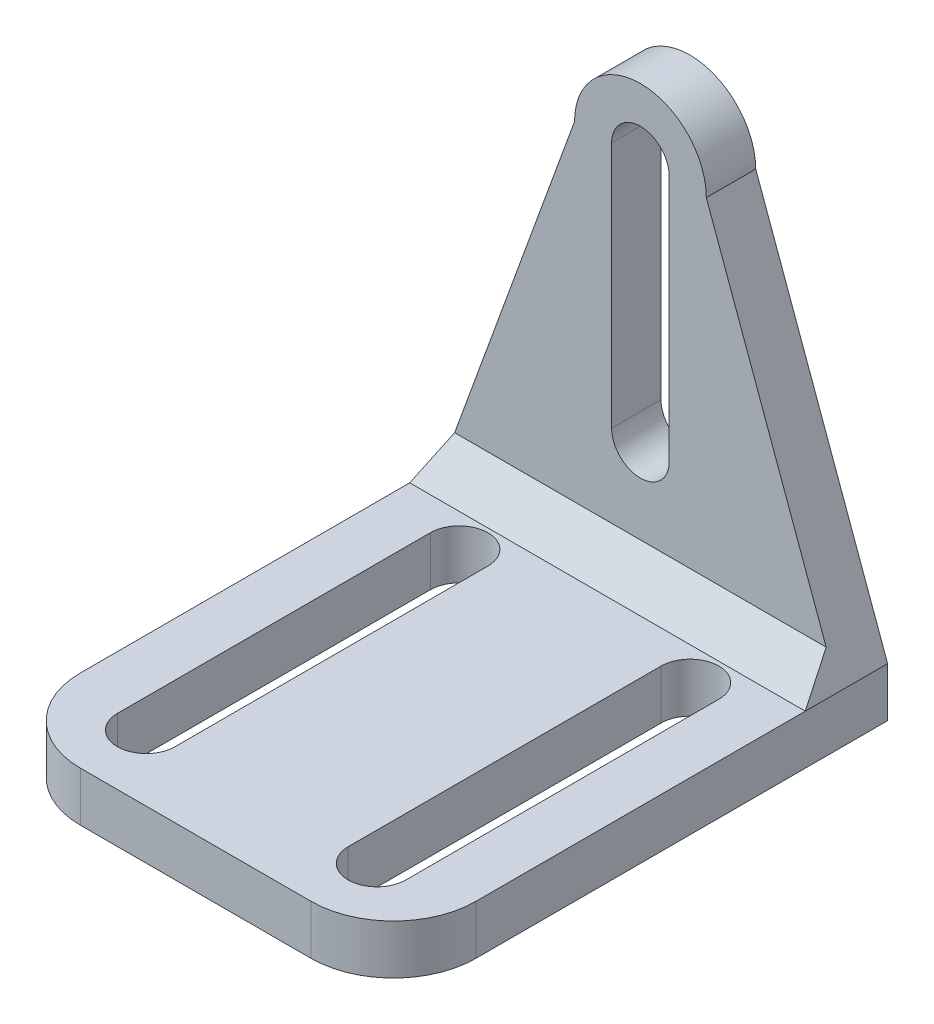
ISO-10303-21;
HEADER;
FILE_DESCRIPTION(('STEP AP214'),'2;1');
FILE_NAME('part.step','',(''),(''),'','','');
FILE_SCHEMA(('AUTOMOTIVE_DESIGN { 1 0 10303 214 1 1 1 1 }'));
ENDSEC;
DATA;
#1=APPLICATION_CONTEXT('core data for automotive mechanical design processes');
#2=APPLICATION_PROTOCOL_DEFINITION('international standard','automotive_design',2000,#1);
#3=PRODUCT_CONTEXT('',#1,'mechanical');
#4=PRODUCT('Part','Part','',(#3));
#5=PRODUCT_RELATED_PRODUCT_CATEGORY('part','',(#4));
#6=PRODUCT_DEFINITION_FORMATION('','',#4);
#7=PRODUCT_DEFINITION_CONTEXT('part definition',#1,'design');
#8=PRODUCT_DEFINITION('design','',#6,#7);
#9=PRODUCT_DEFINITION_SHAPE('','',#8);
#10=(LENGTH_UNIT() NAMED_UNIT(*) SI_UNIT(.MILLI.,.METRE.));
#11=(NAMED_UNIT(*) PLANE_ANGLE_UNIT() SI_UNIT($,.RADIAN.));
#12=(NAMED_UNIT(*) SI_UNIT($,.STERADIAN.) SOLID_ANGLE_UNIT());
#13=UNCERTAINTY_MEASURE_WITH_UNIT(LENGTH_MEASURE(1.E-05),#10,'distance_accuracy_value','');
#14=(GEOMETRIC_REPRESENTATION_CONTEXT(3) GLOBAL_UNCERTAINTY_ASSIGNED_CONTEXT((#13)) GLOBAL_UNIT_ASSIGNED_CONTEXT((#10,
#11,#12)) REPRESENTATION_CONTEXT('',''));
#15=CARTESIAN_POINT('',(0.,0.,0.));
#16=DIRECTION('',(0.,0.,1.));
#17=DIRECTION('',(1.,0.,0.));
#18=AXIS2_PLACEMENT_3D('',#15,#16,#17);
#19=CARTESIAN_POINT('',(1.75,0.,3.));
#20=DIRECTION('',(1.,0.,0.));
#21=DIRECTION('',(0.,1.,0.));
#22=AXIS2_PLACEMENT_3D('',#19,#20,#21);
#23=PLANE('',#22);
#24=DIRECTION('',(0.,-1.,0.));
#25=VECTOR('',#24,1.);
#26=CARTESIAN_POINT('',(1.75,0.,0.));
#27=LINE('',#26,#25);
#28=CARTESIAN_POINT('',(1.75,0.,0.));
#29=VERTEX_POINT('',#28);
#30=CARTESIAN_POINT('',(1.75,-15.,0.));
#31=VERTEX_POINT('',#30);
#32=EDGE_CURVE('E305',#29,#31,#27,.T.);
#33=ORIENTED_EDGE('',*,*,#32,.T.);
#34=DIRECTION('',(0.,0.,-1.));
#35=VECTOR('',#34,1.);
#36=CARTESIAN_POINT('',(1.75,-15.,3.));
#37=LINE('',#36,#35);
#38=CARTESIAN_POINT('',(1.75,-15.,3.));
#39=VERTEX_POINT('',#38);
#40=EDGE_CURVE('E323',#39,#31,#37,.T.);
#41=ORIENTED_EDGE('',*,*,#40,.F.);
#42=DIRECTION('',(0.,-1.,0.));
#43=VECTOR('',#42,1.);
#44=CARTESIAN_POINT('',(1.75,0.,3.));
#45=LINE('',#44,#43);
#46=CARTESIAN_POINT('',(1.75,0.,3.));
#47=VERTEX_POINT('',#46);
#48=EDGE_CURVE('E288',#47,#39,#45,.T.);
#49=ORIENTED_EDGE('',*,*,#48,.F.);
#50=DIRECTION('',(0.,0.,-1.));
#51=VECTOR('',#50,1.);
#52=CARTESIAN_POINT('',(1.75,0.,3.));
#53=LINE('',#52,#51);
#54=EDGE_CURVE('E316',#47,#29,#53,.T.);
#55=ORIENTED_EDGE('',*,*,#54,.T.);
#56=EDGE_LOOP('',(#33,#41,#49,#55));
#57=FACE_BOUND('',#56,.T.);
#58=ADVANCED_FACE('F43',(#57),#23,.F.);
#59=CARTESIAN_POINT('',(0.,-15.,3.));
#60=DIRECTION('',(0.,0.,-1.));
#61=DIRECTION('',(-1.,0.,0.));
#62=AXIS2_PLACEMENT_3D('',#59,#60,#61);
#63=CYLINDRICAL_SURFACE('',#62,1.75);
#64=CARTESIAN_POINT('',(0.,-15.,0.));
#65=DIRECTION('',(0.,0.,1.));
#66=DIRECTION('',(1.,0.,0.));
#67=AXIS2_PLACEMENT_3D('',#64,#65,#66);
#68=CIRCLE('',#67,1.75);
#69=CARTESIAN_POINT('',(-1.75,-15.,0.));
#70=VERTEX_POINT('',#69);
#71=EDGE_CURVE('E308',#70,#31,#68,.T.);
#72=ORIENTED_EDGE('',*,*,#71,.F.);
#73=DIRECTION('',(0.,0.,-1.));
#74=VECTOR('',#73,1.);
#75=CARTESIAN_POINT('',(-1.75,-15.,3.));
#76=LINE('',#75,#74);
#77=CARTESIAN_POINT('',(-1.75,-15.,3.));
#78=VERTEX_POINT('',#77);
#79=EDGE_CURVE('E321',#78,#70,#76,.T.);
#80=ORIENTED_EDGE('',*,*,#79,.F.);
#81=CARTESIAN_POINT('',(0.,-15.,3.));
#82=DIRECTION('',(0.,0.,1.));
#83=DIRECTION('',(1.,0.,0.));
#84=AXIS2_PLACEMENT_3D('',#81,#82,#83);
#85=CIRCLE('',#84,1.75);
#86=EDGE_CURVE('E290',#78,#39,#85,.T.);
#87=ORIENTED_EDGE('',*,*,#86,.T.);
#88=ORIENTED_EDGE('',*,*,#40,.T.);
#89=EDGE_LOOP('',(#72,#80,#87,#88));
#90=FACE_BOUND('',#89,.T.);
#91=ADVANCED_FACE('F427',(#90),#63,.F.);
#92=CARTESIAN_POINT('',(-1.75,0.,3.));
#93=DIRECTION('',(1.,0.,0.));
#94=DIRECTION('',(0.,1.,0.));
#95=AXIS2_PLACEMENT_3D('',#92,#93,#94);
#96=PLANE('',#95);
#97=DIRECTION('',(0.,-1.,0.));
#98=VECTOR('',#97,1.);
#99=CARTESIAN_POINT('',(-1.75,0.,0.));
#100=LINE('',#99,#98);
#101=CARTESIAN_POINT('',(-1.75,0.,0.));
#102=VERTEX_POINT('',#101);
#103=EDGE_CURVE('E311',#102,#70,#100,.T.);
#104=ORIENTED_EDGE('',*,*,#103,.F.);
#105=DIRECTION('',(0.,0.,-1.));
#106=VECTOR('',#105,1.);
#107=CARTESIAN_POINT('',(-1.75,0.,3.));
#108=LINE('',#107,#106);
#109=CARTESIAN_POINT('',(-1.75,0.,3.));
#110=VERTEX_POINT('',#109);
#111=EDGE_CURVE('E318',#110,#102,#108,.T.);
#112=ORIENTED_EDGE('',*,*,#111,.F.);
#113=DIRECTION('',(0.,-1.,0.));
#114=VECTOR('',#113,1.);
#115=CARTESIAN_POINT('',(-1.75,0.,3.));
#116=LINE('',#115,#114);
#117=EDGE_CURVE('E293',#110,#78,#116,.T.);
#118=ORIENTED_EDGE('',*,*,#117,.T.);
#119=ORIENTED_EDGE('',*,*,#79,.T.);
#120=EDGE_LOOP('',(#104,#112,#118,#119));
#121=FACE_BOUND('',#120,.T.);
#122=ADVANCED_FACE('F432',(#121),#96,.T.);
#123=CARTESIAN_POINT('',(3.53208888623797,1.28557521937306,3.));
#124=DIRECTION('',(-0.93969262078591,-0.342020143325663,0.));
#125=DIRECTION('',(0.342020143325663,-0.939692620785911,0.));
#126=AXIS2_PLACEMENT_3D('',#123,#124,#125);
#127=PLANE('',#126);
#128=DIRECTION('',(-0.342020143325663,0.939692620785911,0.));
#129=VECTOR('',#128,1.);
#130=CARTESIAN_POINT('',(3.53208888623797,1.28557521937306,0.));
#131=LINE('',#130,#129);
#132=CARTESIAN_POINT('',(12.0073451538563,-22.,0.));
#133=VERTEX_POINT('',#132);
#134=CARTESIAN_POINT('',(4.,0.,0.));
#135=VERTEX_POINT('',#134);
#136=EDGE_CURVE('E280',#133,#135,#131,.T.);
#137=ORIENTED_EDGE('',*,*,#136,.T.);
#138=DIRECTION('',(0.,0.,-1.));
#139=VECTOR('',#138,1.);
#140=CARTESIAN_POINT('',(4.,0.,3.));
#141=LINE('',#140,#139);
#142=CARTESIAN_POINT('',(4.,0.,3.));
#143=VERTEX_POINT('',#142);
#144=EDGE_CURVE('E319',#143,#135,#141,.T.);
#145=ORIENTED_EDGE('',*,*,#144,.F.);
#146=DIRECTION('',(-0.342020143325663,0.939692620785911,0.));
#147=VECTOR('',#146,1.);
#148=CARTESIAN_POINT('',(3.53208888623797,1.28557521937306,3.));
#149=LINE('',#148,#147);
#150=CARTESIAN_POINT('',(11.2794046853239,-20.,3.));
#151=VERTEX_POINT('',#150);
#152=EDGE_CURVE('E281',#151,#143,#149,.T.);
#153=ORIENTED_EDGE('',*,*,#152,.F.);
#154=DIRECTION('',(0.249243569363949,-0.684791078771734,0.68479107877174));
#155=VECTOR('',#154,1.);
#156=CARTESIAN_POINT('',(7.16510602735606,-8.69605734034066,-8.30394265965946));
#157=LINE('',#156,#155);
#158=CARTESIAN_POINT('',(12.0073451538563,-22.,5.00000000000002));
#159=VERTEX_POINT('',#158);
#160=EDGE_CURVE('E11',#151,#159,#157,.T.);
#161=ORIENTED_EDGE('',*,*,#160,.T.);
#162=DIRECTION('',(0.,0.,-1.));
#163=VECTOR('',#162,1.);
#164=CARTESIAN_POINT('',(12.0073451538563,-22.,3.));
#165=LINE('',#164,#163);
#166=EDGE_CURVE('E59',#159,#133,#165,.T.);
#167=ORIENTED_EDGE('',*,*,#166,.T.);
#168=EDGE_LOOP('',(#137,#145,#153,#161,#167));
#169=FACE_BOUND('',#168,.T.);
#170=ADVANCED_FACE('F382',(#169),#127,.F.);
#171=CARTESIAN_POINT('',(0.,0.,3.));
#172=DIRECTION('',(0.,0.,-1.));
#173=DIRECTION('',(-1.,0.,0.));
#174=AXIS2_PLACEMENT_3D('',#171,#172,#173);
#175=CYLINDRICAL_SURFACE('',#174,4.);
#176=CARTESIAN_POINT('',(0.,0.,0.));
#177=DIRECTION('',(0.,0.,1.));
#178=DIRECTION('',(1.,0.,0.));
#179=AXIS2_PLACEMENT_3D('',#176,#177,#178);
#180=CIRCLE('',#179,4.);
#181=CARTESIAN_POINT('',(-4.,0.,0.));
#182=VERTEX_POINT('',#181);
#183=EDGE_CURVE('E301',#135,#182,#180,.T.);
#184=ORIENTED_EDGE('',*,*,#183,.T.);
#185=DIRECTION('',(0.,0.,-1.));
#186=VECTOR('',#185,1.);
#187=CARTESIAN_POINT('',(-4.,0.,3.));
#188=LINE('',#187,#186);
#189=CARTESIAN_POINT('',(-4.,0.,3.));
#190=VERTEX_POINT('',#189);
#191=EDGE_CURVE('E328',#190,#182,#188,.T.);
#192=ORIENTED_EDGE('',*,*,#191,.F.);
#193=CARTESIAN_POINT('',(0.,0.,3.));
#194=DIRECTION('',(0.,0.,1.));
#195=DIRECTION('',(1.,0.,0.));
#196=AXIS2_PLACEMENT_3D('',#193,#194,#195);
#197=CIRCLE('',#196,4.);
#198=EDGE_CURVE('E283',#143,#190,#197,.T.);
#199=ORIENTED_EDGE('',*,*,#198,.F.);
#200=ORIENTED_EDGE('',*,*,#144,.T.);
#201=EDGE_LOOP('',(#184,#192,#199,#200));
#202=FACE_BOUND('',#201,.T.);
#203=ADVANCED_FACE('F413',(#202),#175,.T.);
#204=CARTESIAN_POINT('',(-3.53208888623797,1.28557521937306,3.));
#205=DIRECTION('',(0.93969262078591,-0.342020143325663,0.));
#206=DIRECTION('',(0.342020143325663,0.939692620785911,0.));
#207=AXIS2_PLACEMENT_3D('',#204,#205,#206);
#208=PLANE('',#207);
#209=DIRECTION('',(-0.342020143325663,-0.939692620785911,0.));
#210=VECTOR('',#209,1.);
#211=CARTESIAN_POINT('',(-3.53208888623797,1.28557521937306,0.));
#212=LINE('',#211,#210);
#213=CARTESIAN_POINT('',(-12.0073451538563,-22.,0.));
#214=VERTEX_POINT('',#213);
#215=EDGE_CURVE('E303',#182,#214,#212,.T.);
#216=ORIENTED_EDGE('',*,*,#215,.T.);
#217=DIRECTION('',(0.,0.,-1.));
#218=VECTOR('',#217,1.);
#219=CARTESIAN_POINT('',(-12.0073451538563,-22.,3.));
#220=LINE('',#219,#218);
#221=CARTESIAN_POINT('',(-12.0073451538563,-22.,5.00000000000002));
#222=VERTEX_POINT('',#221);
#223=EDGE_CURVE('E76',#222,#214,#220,.T.);
#224=ORIENTED_EDGE('',*,*,#223,.F.);
#225=DIRECTION('',(0.249243569363948,0.684791078771734,-0.68479107877174));
#226=VECTOR('',#225,1.);
#227=CARTESIAN_POINT('',(-7.16510602735606,-8.69605734034066,-8.30394265965946));
#228=LINE('',#227,#226);
#229=CARTESIAN_POINT('',(-11.2794046853239,-20.,3.));
#230=VERTEX_POINT('',#229);
#231=EDGE_CURVE('E52',#222,#230,#228,.T.);
#232=ORIENTED_EDGE('',*,*,#231,.T.);
#233=DIRECTION('',(-0.342020143325663,-0.939692620785911,0.));
#234=VECTOR('',#233,1.);
#235=CARTESIAN_POINT('',(-3.53208888623797,1.28557521937306,3.));
#236=LINE('',#235,#234);
#237=EDGE_CURVE('E286',#190,#230,#236,.T.);
#238=ORIENTED_EDGE('',*,*,#237,.F.);
#239=ORIENTED_EDGE('',*,*,#191,.T.);
#240=EDGE_LOOP('',(#216,#224,#232,#238,#239));
#241=FACE_BOUND('',#240,.T.);
#242=ADVANCED_FACE('F414',(#241),#208,.F.);
#243=CARTESIAN_POINT('',(0.,0.,3.));
#244=DIRECTION('',(0.,0.,-1.));
#245=DIRECTION('',(-1.,0.,0.));
#246=AXIS2_PLACEMENT_3D('',#243,#244,#245);
#247=CYLINDRICAL_SURFACE('',#246,1.75);
#248=CARTESIAN_POINT('',(0.,0.,0.));
#249=DIRECTION('',(0.,0.,1.));
#250=DIRECTION('',(1.,0.,0.));
#251=AXIS2_PLACEMENT_3D('',#248,#249,#250);
#252=CIRCLE('',#251,1.75);
#253=EDGE_CURVE('E284',#29,#102,#252,.T.);
#254=ORIENTED_EDGE('',*,*,#253,.F.);
#255=ORIENTED_EDGE('',*,*,#54,.F.);
#256=CARTESIAN_POINT('',(0.,0.,3.));
#257=DIRECTION('',(0.,0.,1.));
#258=DIRECTION('',(1.,0.,0.));
#259=AXIS2_PLACEMENT_3D('',#256,#257,#258);
#260=CIRCLE('',#259,1.75);
#261=EDGE_CURVE('E296',#47,#110,#260,.T.);
#262=ORIENTED_EDGE('',*,*,#261,.T.);
#263=ORIENTED_EDGE('',*,*,#111,.T.);
#264=EDGE_LOOP('',(#254,#255,#262,#263));
#265=FACE_BOUND('',#264,.T.);
#266=ADVANCED_FACE('F416',(#265),#247,.F.);
#267=CARTESIAN_POINT('',(0.,0.,3.));
#268=DIRECTION('',(0.,0.,1.));
#269=DIRECTION('',(1.,0.,0.));
#270=AXIS2_PLACEMENT_3D('',#267,#268,#269);
#271=PLANE('',#270);
#272=ORIENTED_EDGE('',*,*,#237,.T.);
#273=DIRECTION('',(1.,0.,0.));
#274=VECTOR('',#273,1.);
#275=CARTESIAN_POINT('',(0.,-20.,3.));
#276=LINE('',#275,#274);
#277=EDGE_CURVE('E371',#230,#151,#276,.T.);
#278=ORIENTED_EDGE('',*,*,#277,.T.);
#279=ORIENTED_EDGE('',*,*,#152,.T.);
#280=ORIENTED_EDGE('',*,*,#198,.T.);
#281=EDGE_LOOP('',(#272,#278,#279,#280));
#282=FACE_BOUND('',#281,.T.);
#283=ORIENTED_EDGE('',*,*,#48,.T.);
#284=ORIENTED_EDGE('',*,*,#86,.F.);
#285=ORIENTED_EDGE('',*,*,#117,.F.);
#286=ORIENTED_EDGE('',*,*,#261,.F.);
#287=EDGE_LOOP('',(#283,#284,#285,#286));
#288=FACE_BOUND('',#287,.T.);
#289=ADVANCED_FACE('F375',(#282,#288),#271,.T.);
#290=CARTESIAN_POINT('',(0.,0.,0.));
#291=DIRECTION('',(0.,0.,1.));
#292=DIRECTION('',(1.,0.,0.));
#293=AXIS2_PLACEMENT_3D('',#290,#291,#292);
#294=PLANE('',#293);
#295=ORIENTED_EDGE('',*,*,#136,.F.);
#296=DIRECTION('',(0.,-1.,0.));
#297=VECTOR('',#296,1.);
#298=CARTESIAN_POINT('',(12.0073451538563,0.,0.));
#299=LINE('',#298,#297);
#300=CARTESIAN_POINT('',(12.0073451538563,-25.,0.));
#301=VERTEX_POINT('',#300);
#302=EDGE_CURVE('E267',#133,#301,#299,.T.);
#303=ORIENTED_EDGE('',*,*,#302,.T.);
#304=DIRECTION('',(1.,0.,0.));
#305=VECTOR('',#304,1.);
#306=CARTESIAN_POINT('',(0.,-25.,0.));
#307=LINE('',#306,#305);
#308=CARTESIAN_POINT('',(-12.0073451538563,-25.,0.));
#309=VERTEX_POINT('',#308);
#310=EDGE_CURVE('E234',#309,#301,#307,.T.);
#311=ORIENTED_EDGE('',*,*,#310,.F.);
#312=DIRECTION('',(0.,1.,0.));
#313=VECTOR('',#312,1.);
#314=CARTESIAN_POINT('',(-12.0073451538563,0.,0.));
#315=LINE('',#314,#313);
#316=EDGE_CURVE('E261',#309,#214,#315,.T.);
#317=ORIENTED_EDGE('',*,*,#316,.T.);
#318=ORIENTED_EDGE('',*,*,#215,.F.);
#319=ORIENTED_EDGE('',*,*,#183,.F.);
#320=EDGE_LOOP('',(#295,#303,#311,#317,#318,#319));
#321=FACE_BOUND('',#320,.T.);
#322=ORIENTED_EDGE('',*,*,#32,.F.);
#323=ORIENTED_EDGE('',*,*,#253,.T.);
#324=ORIENTED_EDGE('',*,*,#103,.T.);
#325=ORIENTED_EDGE('',*,*,#71,.T.);
#326=EDGE_LOOP('',(#322,#323,#324,#325));
#327=FACE_BOUND('',#326,.T.);
#328=ADVANCED_FACE('F408',(#321,#327),#294,.F.);
#329=CARTESIAN_POINT('',(0.,-22.,30.));
#330=DIRECTION('',(0.,-1.,0.));
#331=DIRECTION('',(1.,0.,0.));
#332=AXIS2_PLACEMENT_3D('',#329,#330,#331);
#333=PLANE('',#332);
#334=DIRECTION('',(0.,0.,1.));
#335=VECTOR('',#334,1.);
#336=CARTESIAN_POINT('',(-8.7573451538563,-22.,0.));
#337=LINE('',#336,#335);
#338=CARTESIAN_POINT('',(-8.75734515385629,-22.,7.00000000000001));
#339=VERTEX_POINT('',#338);
#340=CARTESIAN_POINT('',(-8.7573451538563,-22.,26.));
#341=VERTEX_POINT('',#340);
#342=EDGE_CURVE('E217',#339,#341,#337,.T.);
#343=ORIENTED_EDGE('',*,*,#342,.F.);
#344=CARTESIAN_POINT('',(-7.0073451538563,-22.,7.));
#345=DIRECTION('',(0.,1.,0.));
#346=DIRECTION('',(-1.,0.,0.));
#347=AXIS2_PLACEMENT_3D('',#344,#345,#346);
#348=CIRCLE('',#347,1.75);
#349=CARTESIAN_POINT('',(-5.2573451538563,-22.,7.));
#350=VERTEX_POINT('',#349);
#351=EDGE_CURVE('E222',#350,#339,#348,.T.);
#352=ORIENTED_EDGE('',*,*,#351,.F.);
#353=DIRECTION('',(0.,0.,1.));
#354=VECTOR('',#353,1.);
#355=CARTESIAN_POINT('',(-5.2573451538563,-22.,0.));
#356=LINE('',#355,#354);
#357=CARTESIAN_POINT('',(-5.25734515385629,-22.,26.));
#358=VERTEX_POINT('',#357);
#359=EDGE_CURVE('E227',#350,#358,#356,.T.);
#360=ORIENTED_EDGE('',*,*,#359,.T.);
#361=CARTESIAN_POINT('',(-7.00734515385629,-22.,26.));
#362=DIRECTION('',(0.,1.,0.));
#363=DIRECTION('',(-1.,0.,0.));
#364=AXIS2_PLACEMENT_3D('',#361,#362,#363);
#365=CIRCLE('',#364,1.75);
#366=EDGE_CURVE('E206',#341,#358,#365,.T.);
#367=ORIENTED_EDGE('',*,*,#366,.F.);
#368=EDGE_LOOP('',(#343,#352,#360,#367));
#369=FACE_BOUND('',#368,.T.);
#370=DIRECTION('',(0.,0.,-1.));
#371=VECTOR('',#370,1.);
#372=CARTESIAN_POINT('',(8.7573451538563,-22.,0.));
#373=LINE('',#372,#371);
#374=CARTESIAN_POINT('',(8.7573451538563,-22.,26.));
#375=VERTEX_POINT('',#374);
#376=CARTESIAN_POINT('',(8.7573451538563,-22.,7.));
#377=VERTEX_POINT('',#376);
#378=EDGE_CURVE('E239',#375,#377,#373,.T.);
#379=ORIENTED_EDGE('',*,*,#378,.F.);
#380=CARTESIAN_POINT('',(7.0073451538563,-22.,26.));
#381=DIRECTION('',(0.,1.,0.));
#382=DIRECTION('',(-1.,0.,0.));
#383=AXIS2_PLACEMENT_3D('',#380,#381,#382);
#384=CIRCLE('',#383,1.75);
#385=CARTESIAN_POINT('',(5.2573451538563,-22.,26.));
#386=VERTEX_POINT('',#385);
#387=EDGE_CURVE('E237',#386,#375,#384,.T.);
#388=ORIENTED_EDGE('',*,*,#387,.F.);
#389=DIRECTION('',(0.,0.,1.));
#390=VECTOR('',#389,1.);
#391=CARTESIAN_POINT('',(5.2573451538563,-22.,0.));
#392=LINE('',#391,#390);
#393=CARTESIAN_POINT('',(5.2573451538563,-22.,7.));
#394=VERTEX_POINT('',#393);
#395=EDGE_CURVE('E245',#394,#386,#392,.T.);
#396=ORIENTED_EDGE('',*,*,#395,.F.);
#397=CARTESIAN_POINT('',(7.0073451538563,-22.,7.));
#398=DIRECTION('',(0.,1.,0.));
#399=DIRECTION('',(-1.,0.,0.));
#400=AXIS2_PLACEMENT_3D('',#397,#398,#399);
#401=CIRCLE('',#400,1.75);
#402=EDGE_CURVE('E242',#377,#394,#401,.T.);
#403=ORIENTED_EDGE('',*,*,#402,.F.);
#404=EDGE_LOOP('',(#379,#388,#396,#403));
#405=FACE_BOUND('',#404,.T.);
#406=DIRECTION('',(0.,0.,-1.));
#407=VECTOR('',#406,1.);
#408=CARTESIAN_POINT('',(12.0073451538563,-22.,30.));
#409=LINE('',#408,#407);
#410=CARTESIAN_POINT('',(12.0073451538563,-22.,25.));
#411=VERTEX_POINT('',#410);
#412=EDGE_CURVE('E276',#411,#159,#409,.T.);
#413=ORIENTED_EDGE('',*,*,#412,.T.);
#414=DIRECTION('',(-1.,0.,0.));
#415=VECTOR('',#414,1.);
#416=CARTESIAN_POINT('',(0.,-22.,5.00000000000002));
#417=LINE('',#416,#415);
#418=EDGE_CURVE('E368',#159,#222,#417,.T.);
#419=ORIENTED_EDGE('',*,*,#418,.T.);
#420=DIRECTION('',(0.,0.,-1.));
#421=VECTOR('',#420,1.);
#422=CARTESIAN_POINT('',(-12.0073451538563,-22.,30.));
#423=LINE('',#422,#421);
#424=CARTESIAN_POINT('',(-12.0073451538563,-22.,25.));
#425=VERTEX_POINT('',#424);
#426=EDGE_CURVE('E273',#425,#222,#423,.T.);
#427=ORIENTED_EDGE('',*,*,#426,.F.);
#428=CARTESIAN_POINT('',(-7.0073451538563,-22.,25.));
#429=DIRECTION('',(0.,-1.,0.));
#430=DIRECTION('',(1.,0.,0.));
#431=AXIS2_PLACEMENT_3D('',#428,#429,#430);
#432=CIRCLE('',#431,5.);
#433=CARTESIAN_POINT('',(-7.0073451538563,-22.,30.));
#434=VERTEX_POINT('',#433);
#435=EDGE_CURVE('E357',#425,#434,#432,.F.);
#436=ORIENTED_EDGE('',*,*,#435,.T.);
#437=DIRECTION('',(-1.,0.,0.));
#438=VECTOR('',#437,1.);
#439=CARTESIAN_POINT('',(0.,-22.,30.));
#440=LINE('',#439,#438);
#441=CARTESIAN_POINT('',(7.0073451538563,-22.,30.));
#442=VERTEX_POINT('',#441);
#443=EDGE_CURVE('E260',#442,#434,#440,.T.);
#444=ORIENTED_EDGE('',*,*,#443,.F.);
#445=CARTESIAN_POINT('',(7.0073451538563,-22.,25.));
#446=DIRECTION('',(0.,-1.,0.));
#447=DIRECTION('',(1.,0.,0.));
#448=AXIS2_PLACEMENT_3D('',#445,#446,#447);
#449=CIRCLE('',#448,5.);
#450=EDGE_CURVE('E355',#442,#411,#449,.F.);
#451=ORIENTED_EDGE('',*,*,#450,.T.);
#452=EDGE_LOOP('',(#413,#419,#427,#436,#444,#451));
#453=FACE_BOUND('',#452,.T.);
#454=ADVANCED_FACE('F224',(#369,#405,#453),#333,.F.);
#455=CARTESIAN_POINT('',(0.,-25.,30.));
#456=DIRECTION('',(0.,1.,0.));
#457=DIRECTION('',(-1.,0.,0.));
#458=AXIS2_PLACEMENT_3D('',#455,#456,#457);
#459=PLANE('',#458);
#460=DIRECTION('',(0.,0.,1.));
#461=VECTOR('',#460,1.);
#462=CARTESIAN_POINT('',(-5.25734515385629,-25.,30.));
#463=LINE('',#462,#461);
#464=CARTESIAN_POINT('',(-5.2573451538563,-25.,7.));
#465=VERTEX_POINT('',#464);
#466=CARTESIAN_POINT('',(-5.25734515385629,-25.,26.));
#467=VERTEX_POINT('',#466);
#468=EDGE_CURVE('E347',#465,#467,#463,.T.);
#469=ORIENTED_EDGE('',*,*,#468,.F.);
#470=CARTESIAN_POINT('',(-7.0073451538563,-25.,7.));
#471=DIRECTION('',(0.,1.,0.));
#472=DIRECTION('',(-1.,0.,0.));
#473=AXIS2_PLACEMENT_3D('',#470,#471,#472);
#474=CIRCLE('',#473,1.75);
#475=CARTESIAN_POINT('',(-8.7573451538563,-25.,7.));
#476=VERTEX_POINT('',#475);
#477=EDGE_CURVE('E349',#465,#476,#474,.T.);
#478=ORIENTED_EDGE('',*,*,#477,.T.);
#479=DIRECTION('',(0.,0.,1.));
#480=VECTOR('',#479,1.);
#481=CARTESIAN_POINT('',(-8.75734515385629,-25.,30.));
#482=LINE('',#481,#480);
#483=CARTESIAN_POINT('',(-8.75734515385629,-25.,26.));
#484=VERTEX_POINT('',#483);
#485=EDGE_CURVE('E344',#476,#484,#482,.T.);
#486=ORIENTED_EDGE('',*,*,#485,.T.);
#487=CARTESIAN_POINT('',(-7.00734515385629,-25.,26.));
#488=DIRECTION('',(0.,1.,0.));
#489=DIRECTION('',(-1.,0.,0.));
#490=AXIS2_PLACEMENT_3D('',#487,#488,#489);
#491=CIRCLE('',#490,1.75);
#492=EDGE_CURVE('E209',#484,#467,#491,.T.);
#493=ORIENTED_EDGE('',*,*,#492,.T.);
#494=EDGE_LOOP('',(#469,#478,#486,#493));
#495=FACE_BOUND('',#494,.T.);
#496=DIRECTION('',(0.,0.,1.));
#497=VECTOR('',#496,1.);
#498=CARTESIAN_POINT('',(5.2573451538563,-25.,30.));
#499=LINE('',#498,#497);
#500=CARTESIAN_POINT('',(5.2573451538563,-25.,7.));
#501=VERTEX_POINT('',#500);
#502=CARTESIAN_POINT('',(5.2573451538563,-25.,26.));
#503=VERTEX_POINT('',#502);
#504=EDGE_CURVE('E338',#501,#503,#499,.T.);
#505=ORIENTED_EDGE('',*,*,#504,.T.);
#506=CARTESIAN_POINT('',(7.0073451538563,-25.,26.));
#507=DIRECTION('',(0.,1.,0.));
#508=DIRECTION('',(-1.,0.,0.));
#509=AXIS2_PLACEMENT_3D('',#506,#507,#508);
#510=CIRCLE('',#509,1.75);
#511=CARTESIAN_POINT('',(8.7573451538563,-25.,26.));
#512=VERTEX_POINT('',#511);
#513=EDGE_CURVE('E341',#503,#512,#510,.T.);
#514=ORIENTED_EDGE('',*,*,#513,.T.);
#515=DIRECTION('',(0.,0.,-1.));
#516=VECTOR('',#515,1.);
#517=CARTESIAN_POINT('',(8.7573451538563,-25.,30.));
#518=LINE('',#517,#516);
#519=CARTESIAN_POINT('',(8.7573451538563,-25.,7.));
#520=VERTEX_POINT('',#519);
#521=EDGE_CURVE('E325',#512,#520,#518,.T.);
#522=ORIENTED_EDGE('',*,*,#521,.T.);
#523=CARTESIAN_POINT('',(7.0073451538563,-25.,7.));
#524=DIRECTION('',(0.,1.,0.));
#525=DIRECTION('',(-1.,0.,0.));
#526=AXIS2_PLACEMENT_3D('',#523,#524,#525);
#527=CIRCLE('',#526,1.75);
#528=EDGE_CURVE('E335',#520,#501,#527,.T.);
#529=ORIENTED_EDGE('',*,*,#528,.T.);
#530=EDGE_LOOP('',(#505,#514,#522,#529));
#531=FACE_BOUND('',#530,.T.);
#532=DIRECTION('',(1.,0.,0.));
#533=VECTOR('',#532,1.);
#534=CARTESIAN_POINT('',(0.,-25.,30.));
#535=LINE('',#534,#533);
#536=CARTESIAN_POINT('',(-7.0073451538563,-25.,30.));
#537=VERTEX_POINT('',#536);
#538=CARTESIAN_POINT('',(7.0073451538563,-25.,30.));
#539=VERTEX_POINT('',#538);
#540=EDGE_CURVE('E257',#537,#539,#535,.T.);
#541=ORIENTED_EDGE('',*,*,#540,.F.);
#542=CARTESIAN_POINT('',(-7.0073451538563,-25.,25.));
#543=DIRECTION('',(0.,1.,0.));
#544=DIRECTION('',(-1.,0.,0.));
#545=AXIS2_PLACEMENT_3D('',#542,#543,#544);
#546=CIRCLE('',#545,5.);
#547=CARTESIAN_POINT('',(-12.0073451538563,-25.,25.));
#548=VERTEX_POINT('',#547);
#549=EDGE_CURVE('E364',#537,#548,#546,.F.);
#550=ORIENTED_EDGE('',*,*,#549,.T.);
#551=DIRECTION('',(0.,0.,-1.));
#552=VECTOR('',#551,1.);
#553=CARTESIAN_POINT('',(-12.0073451538563,-25.,30.));
#554=LINE('',#553,#552);
#555=EDGE_CURVE('E264',#548,#309,#554,.T.);
#556=ORIENTED_EDGE('',*,*,#555,.T.);
#557=ORIENTED_EDGE('',*,*,#310,.T.);
#558=DIRECTION('',(0.,0.,-1.));
#559=VECTOR('',#558,1.);
#560=CARTESIAN_POINT('',(12.0073451538563,-25.,30.));
#561=LINE('',#560,#559);
#562=CARTESIAN_POINT('',(12.0073451538563,-25.,25.));
#563=VERTEX_POINT('',#562);
#564=EDGE_CURVE('E278',#563,#301,#561,.T.);
#565=ORIENTED_EDGE('',*,*,#564,.F.);
#566=CARTESIAN_POINT('',(7.0073451538563,-25.,25.));
#567=DIRECTION('',(0.,1.,0.));
#568=DIRECTION('',(-1.,0.,0.));
#569=AXIS2_PLACEMENT_3D('',#566,#567,#568);
#570=CIRCLE('',#569,5.);
#571=EDGE_CURVE('E83',#563,#539,#570,.F.);
#572=ORIENTED_EDGE('',*,*,#571,.T.);
#573=EDGE_LOOP('',(#541,#550,#556,#557,#565,#572));
#574=FACE_BOUND('',#573,.T.);
#575=ADVANCED_FACE('F404',(#495,#531,#574),#459,.F.);
#576=CARTESIAN_POINT('',(12.0073451538563,0.,30.));
#577=DIRECTION('',(1.,0.,0.));
#578=DIRECTION('',(0.,0.,-1.));
#579=AXIS2_PLACEMENT_3D('',#576,#577,#578);
#580=PLANE('',#579);
#581=ORIENTED_EDGE('',*,*,#412,.F.);
#582=DIRECTION('',(0.,-1.,0.));
#583=VECTOR('',#582,1.);
#584=CARTESIAN_POINT('',(12.0073451538563,0.,25.));
#585=LINE('',#584,#583);
#586=EDGE_CURVE('E366',#411,#563,#585,.T.);
#587=ORIENTED_EDGE('',*,*,#586,.T.);
#588=ORIENTED_EDGE('',*,*,#564,.T.);
#589=ORIENTED_EDGE('',*,*,#302,.F.);
#590=ORIENTED_EDGE('',*,*,#166,.F.);
#591=EDGE_LOOP('',(#581,#587,#588,#589,#590));
#592=FACE_BOUND('',#591,.T.);
#593=ADVANCED_FACE('F401',(#592),#580,.T.);
#594=CARTESIAN_POINT('',(-12.0073451538563,0.,30.));
#595=DIRECTION('',(-1.,0.,0.));
#596=DIRECTION('',(0.,0.,1.));
#597=AXIS2_PLACEMENT_3D('',#594,#595,#596);
#598=PLANE('',#597);
#599=ORIENTED_EDGE('',*,*,#555,.F.);
#600=DIRECTION('',(0.,1.,0.));
#601=VECTOR('',#600,1.);
#602=CARTESIAN_POINT('',(-12.0073451538563,0.,25.));
#603=LINE('',#602,#601);
#604=EDGE_CURVE('E352',#548,#425,#603,.T.);
#605=ORIENTED_EDGE('',*,*,#604,.T.);
#606=ORIENTED_EDGE('',*,*,#426,.T.);
#607=ORIENTED_EDGE('',*,*,#223,.T.);
#608=ORIENTED_EDGE('',*,*,#316,.F.);
#609=EDGE_LOOP('',(#599,#605,#606,#607,#608));
#610=FACE_BOUND('',#609,.T.);
#611=ADVANCED_FACE('F388',(#610),#598,.T.);
#612=CARTESIAN_POINT('',(0.,0.,30.));
#613=DIRECTION('',(0.,0.,1.));
#614=DIRECTION('',(1.,0.,0.));
#615=AXIS2_PLACEMENT_3D('',#612,#613,#614);
#616=PLANE('',#615);
#617=ORIENTED_EDGE('',*,*,#443,.T.);
#618=DIRECTION('',(0.,1.,0.));
#619=VECTOR('',#618,1.);
#620=CARTESIAN_POINT('',(-7.0073451538563,0.,30.));
#621=LINE('',#620,#619);
#622=EDGE_CURVE('E361',#434,#537,#621,.F.);
#623=ORIENTED_EDGE('',*,*,#622,.T.);
#624=ORIENTED_EDGE('',*,*,#540,.T.);
#625=DIRECTION('',(0.,-1.,0.));
#626=VECTOR('',#625,1.);
#627=CARTESIAN_POINT('',(7.0073451538563,0.,30.));
#628=LINE('',#627,#626);
#629=EDGE_CURVE('E359',#539,#442,#628,.F.);
#630=ORIENTED_EDGE('',*,*,#629,.T.);
#631=EDGE_LOOP('',(#617,#623,#624,#630));
#632=FACE_BOUND('',#631,.T.);
#633=ADVANCED_FACE('F398',(#632),#616,.T.);
#634=CARTESIAN_POINT('',(7.0073451538563,-37.,26.));
#635=DIRECTION('',(0.,1.,0.));
#636=DIRECTION('',(-1.,0.,0.));
#637=AXIS2_PLACEMENT_3D('',#634,#635,#636);
#638=CYLINDRICAL_SURFACE('',#637,1.75);
#639=DIRECTION('',(0.,1.,0.));
#640=VECTOR('',#639,1.);
#641=CARTESIAN_POINT('',(5.2573451538563,-37.,26.));
#642=LINE('',#641,#640);
#643=EDGE_CURVE('E249',#503,#386,#642,.T.);
#644=ORIENTED_EDGE('',*,*,#643,.T.);
#645=ORIENTED_EDGE('',*,*,#387,.T.);
#646=DIRECTION('',(0.,1.,0.));
#647=VECTOR('',#646,1.);
#648=CARTESIAN_POINT('',(8.7573451538563,-37.,26.));
#649=LINE('',#648,#647);
#650=EDGE_CURVE('E248',#512,#375,#649,.T.);
#651=ORIENTED_EDGE('',*,*,#650,.F.);
#652=ORIENTED_EDGE('',*,*,#513,.F.);
#653=EDGE_LOOP('',(#644,#645,#651,#652));
#654=FACE_BOUND('',#653,.T.);
#655=ADVANCED_FACE('F454',(#654),#638,.F.);
#656=CARTESIAN_POINT('',(5.25734515385631,-37.,0.));
#657=DIRECTION('',(-1.,0.,0.));
#658=DIRECTION('',(0.,-1.,0.));
#659=AXIS2_PLACEMENT_3D('',#656,#657,#658);
#660=PLANE('',#659);
#661=DIRECTION('',(0.,1.,0.));
#662=VECTOR('',#661,1.);
#663=CARTESIAN_POINT('',(5.2573451538563,-37.,7.));
#664=LINE('',#663,#662);
#665=EDGE_CURVE('E251',#501,#394,#664,.T.);
#666=ORIENTED_EDGE('',*,*,#665,.T.);
#667=ORIENTED_EDGE('',*,*,#395,.T.);
#668=ORIENTED_EDGE('',*,*,#643,.F.);
#669=ORIENTED_EDGE('',*,*,#504,.F.);
#670=EDGE_LOOP('',(#666,#667,#668,#669));
#671=FACE_BOUND('',#670,.T.);
#672=ADVANCED_FACE('F457',(#671),#660,.F.);
#673=CARTESIAN_POINT('',(7.00734515385631,-37.,7.));
#674=DIRECTION('',(0.,1.,0.));
#675=DIRECTION('',(-1.,0.,0.));
#676=AXIS2_PLACEMENT_3D('',#673,#674,#675);
#677=CYLINDRICAL_SURFACE('',#676,1.75);
#678=DIRECTION('',(0.,1.,0.));
#679=VECTOR('',#678,1.);
#680=CARTESIAN_POINT('',(8.75734515385631,-37.,7.));
#681=LINE('',#680,#679);
#682=EDGE_CURVE('E253',#520,#377,#681,.T.);
#683=ORIENTED_EDGE('',*,*,#682,.T.);
#684=ORIENTED_EDGE('',*,*,#402,.T.);
#685=ORIENTED_EDGE('',*,*,#665,.F.);
#686=ORIENTED_EDGE('',*,*,#528,.F.);
#687=EDGE_LOOP('',(#683,#684,#685,#686));
#688=FACE_BOUND('',#687,.T.);
#689=ADVANCED_FACE('F463',(#688),#677,.F.);
#690=CARTESIAN_POINT('',(8.75734515385631,-37.,0.));
#691=DIRECTION('',(1.,0.,0.));
#692=DIRECTION('',(0.,1.,0.));
#693=AXIS2_PLACEMENT_3D('',#690,#691,#692);
#694=PLANE('',#693);
#695=ORIENTED_EDGE('',*,*,#650,.T.);
#696=ORIENTED_EDGE('',*,*,#378,.T.);
#697=ORIENTED_EDGE('',*,*,#682,.F.);
#698=ORIENTED_EDGE('',*,*,#521,.F.);
#699=EDGE_LOOP('',(#695,#696,#697,#698));
#700=FACE_BOUND('',#699,.T.);
#701=ADVANCED_FACE('F459',(#700),#694,.F.);
#702=CARTESIAN_POINT('',(-7.00734515385629,-37.,7.));
#703=DIRECTION('',(0.,1.,0.));
#704=DIRECTION('',(-1.,0.,0.));
#705=AXIS2_PLACEMENT_3D('',#702,#703,#704);
#706=CYLINDRICAL_SURFACE('',#705,1.75);
#707=DIRECTION('',(0.,1.,0.));
#708=VECTOR('',#707,1.);
#709=CARTESIAN_POINT('',(-5.25734515385629,-37.,7.));
#710=LINE('',#709,#708);
#711=EDGE_CURVE('E232',#465,#350,#710,.T.);
#712=ORIENTED_EDGE('',*,*,#711,.T.);
#713=ORIENTED_EDGE('',*,*,#351,.T.);
#714=DIRECTION('',(0.,1.,0.));
#715=VECTOR('',#714,1.);
#716=CARTESIAN_POINT('',(-8.75734515385629,-37.,7.));
#717=LINE('',#716,#715);
#718=EDGE_CURVE('E213',#476,#339,#717,.T.);
#719=ORIENTED_EDGE('',*,*,#718,.F.);
#720=ORIENTED_EDGE('',*,*,#477,.F.);
#721=EDGE_LOOP('',(#712,#713,#719,#720));
#722=FACE_BOUND('',#721,.T.);
#723=ADVANCED_FACE('F462',(#722),#706,.F.);
#724=CARTESIAN_POINT('',(-5.25734515385629,-37.,0.));
#725=DIRECTION('',(-1.,0.,0.));
#726=DIRECTION('',(0.,-1.,0.));
#727=AXIS2_PLACEMENT_3D('',#724,#725,#726);
#728=PLANE('',#727);
#729=ORIENTED_EDGE('',*,*,#468,.T.);
#730=DIRECTION('',(0.,1.,0.));
#731=VECTOR('',#730,1.);
#732=CARTESIAN_POINT('',(-5.25734515385629,-37.,26.));
#733=LINE('',#732,#731);
#734=EDGE_CURVE('E212',#467,#358,#733,.T.);
#735=ORIENTED_EDGE('',*,*,#734,.T.);
#736=ORIENTED_EDGE('',*,*,#359,.F.);
#737=ORIENTED_EDGE('',*,*,#711,.F.);
#738=EDGE_LOOP('',(#729,#735,#736,#737));
#739=FACE_BOUND('',#738,.T.);
#740=ADVANCED_FACE('F473',(#739),#728,.T.);
#741=CARTESIAN_POINT('',(-7.00734515385629,-37.,26.));
#742=DIRECTION('',(0.,1.,0.));
#743=DIRECTION('',(-1.,0.,0.));
#744=AXIS2_PLACEMENT_3D('',#741,#742,#743);
#745=CYLINDRICAL_SURFACE('',#744,1.75);
#746=DIRECTION('',(0.,1.,0.));
#747=VECTOR('',#746,1.);
#748=CARTESIAN_POINT('',(-8.75734515385629,-37.,26.));
#749=LINE('',#748,#747);
#750=EDGE_CURVE('E201',#484,#341,#749,.T.);
#751=ORIENTED_EDGE('',*,*,#750,.T.);
#752=ORIENTED_EDGE('',*,*,#366,.T.);
#753=ORIENTED_EDGE('',*,*,#734,.F.);
#754=ORIENTED_EDGE('',*,*,#492,.F.);
#755=EDGE_LOOP('',(#751,#752,#753,#754));
#756=FACE_BOUND('',#755,.T.);
#757=ADVANCED_FACE('F203',(#756),#745,.F.);
#758=CARTESIAN_POINT('',(-8.75734515385629,-37.,0.));
#759=DIRECTION('',(-1.,0.,0.));
#760=DIRECTION('',(0.,-1.,0.));
#761=AXIS2_PLACEMENT_3D('',#758,#759,#760);
#762=PLANE('',#761);
#763=ORIENTED_EDGE('',*,*,#718,.T.);
#764=ORIENTED_EDGE('',*,*,#342,.T.);
#765=ORIENTED_EDGE('',*,*,#750,.F.);
#766=ORIENTED_EDGE('',*,*,#485,.F.);
#767=EDGE_LOOP('',(#763,#764,#765,#766));
#768=FACE_BOUND('',#767,.T.);
#769=ADVANCED_FACE('F218',(#768),#762,.F.);
#770=CARTESIAN_POINT('',(-7.0073451538563,0.,25.));
#771=DIRECTION('',(0.,1.,0.));
#772=DIRECTION('',(0.,0.,1.));
#773=AXIS2_PLACEMENT_3D('',#770,#771,#772);
#774=CYLINDRICAL_SURFACE('',#773,5.);
#775=ORIENTED_EDGE('',*,*,#549,.F.);
#776=ORIENTED_EDGE('',*,*,#622,.F.);
#777=ORIENTED_EDGE('',*,*,#435,.F.);
#778=ORIENTED_EDGE('',*,*,#604,.F.);
#779=EDGE_LOOP('',(#775,#776,#777,#778));
#780=FACE_BOUND('',#779,.T.);
#781=ADVANCED_FACE('F393',(#780),#774,.T.);
#782=CARTESIAN_POINT('',(7.0073451538563,0.,25.));
#783=DIRECTION('',(0.,-1.,0.));
#784=DIRECTION('',(0.,0.,-1.));
#785=AXIS2_PLACEMENT_3D('',#782,#783,#784);
#786=CYLINDRICAL_SURFACE('',#785,5.);
#787=ORIENTED_EDGE('',*,*,#450,.F.);
#788=ORIENTED_EDGE('',*,*,#629,.F.);
#789=ORIENTED_EDGE('',*,*,#571,.F.);
#790=ORIENTED_EDGE('',*,*,#586,.F.);
#791=EDGE_LOOP('',(#787,#788,#789,#790));
#792=FACE_BOUND('',#791,.T.);
#793=ADVANCED_FACE('F400',(#792),#786,.T.);
#794=CARTESIAN_POINT('',(0.,-22.,5.00000000000002));
#795=DIRECTION('',(0.,-0.707106781186551,-0.707106781186544));
#796=DIRECTION('',(-1.,0.,0.));
#797=AXIS2_PLACEMENT_3D('',#794,#795,#796);
#798=PLANE('',#797);
#799=ORIENTED_EDGE('',*,*,#160,.F.);
#800=ORIENTED_EDGE('',*,*,#277,.F.);
#801=ORIENTED_EDGE('',*,*,#231,.F.);
#802=ORIENTED_EDGE('',*,*,#418,.F.);
#803=EDGE_LOOP('',(#799,#800,#801,#802));
#804=FACE_BOUND('',#803,.T.);
#805=ADVANCED_FACE('F46',(#804),#798,.F.);
#806=CLOSED_SHELL('',(#58,#91,#122,#170,#203,#242,#266,#289,#328,#454,#575,#593,#611,#633,#655,
#672,#689,#701,#723,#740,#757,#769,#781,#793,#805));
#807=MANIFOLD_SOLID_BREP('B2',#806);
#808=ADVANCED_BREP_SHAPE_REPRESENTATION('',(#18,#807),#14);
#809=SHAPE_DEFINITION_REPRESENTATION(#9,#808);
ENDSEC;
END-ISO-10303-21;
